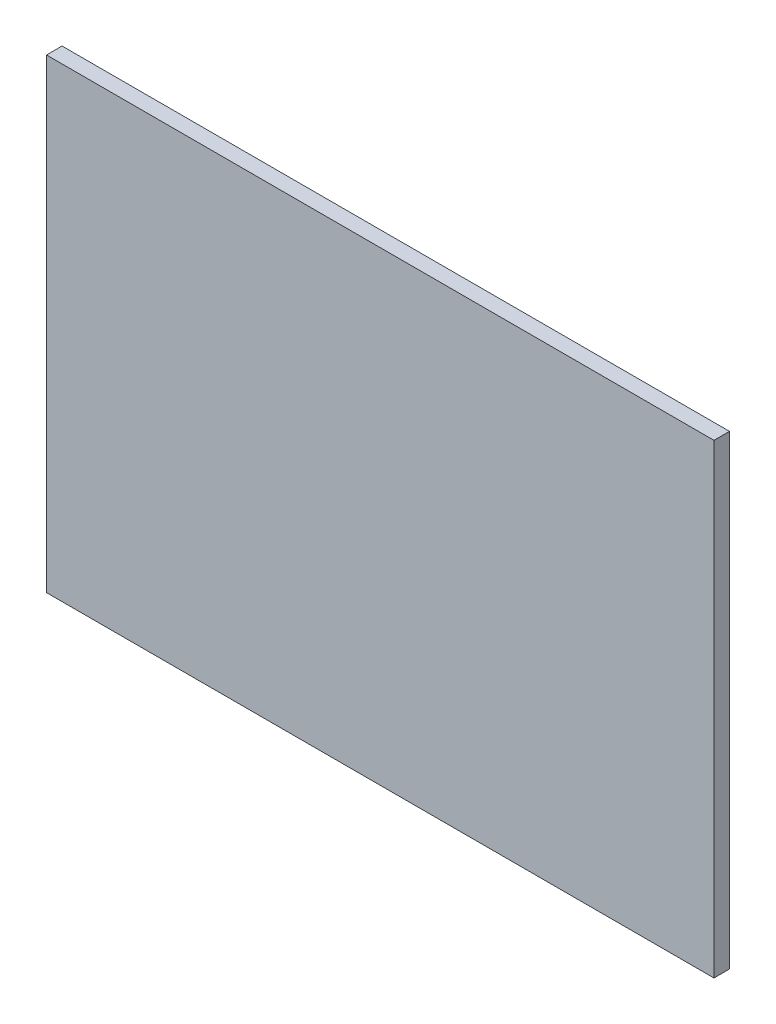
ISO-10303-21;
HEADER;
FILE_DESCRIPTION(('STEP AP214'),'2;1');
FILE_NAME('part.step','',(''),(''),'','','');
FILE_SCHEMA(('AUTOMOTIVE_DESIGN { 1 0 10303 214 1 1 1 1 }'));
ENDSEC;
DATA;
#1=APPLICATION_CONTEXT('core data for automotive mechanical design processes');
#2=APPLICATION_PROTOCOL_DEFINITION('international standard','automotive_design',2000,#1);
#3=PRODUCT_CONTEXT('',#1,'mechanical');
#4=PRODUCT('Part','Part','',(#3));
#5=PRODUCT_RELATED_PRODUCT_CATEGORY('part','',(#4));
#6=PRODUCT_DEFINITION_FORMATION('','',#4);
#7=PRODUCT_DEFINITION_CONTEXT('part definition',#1,'design');
#8=PRODUCT_DEFINITION('design','',#6,#7);
#9=PRODUCT_DEFINITION_SHAPE('','',#8);
#10=(LENGTH_UNIT() NAMED_UNIT(*) SI_UNIT(.MILLI.,.METRE.));
#11=(NAMED_UNIT(*) PLANE_ANGLE_UNIT() SI_UNIT($,.RADIAN.));
#12=(NAMED_UNIT(*) SI_UNIT($,.STERADIAN.) SOLID_ANGLE_UNIT());
#13=UNCERTAINTY_MEASURE_WITH_UNIT(LENGTH_MEASURE(1.E-05),#10,'distance_accuracy_value','');
#14=(GEOMETRIC_REPRESENTATION_CONTEXT(3) GLOBAL_UNCERTAINTY_ASSIGNED_CONTEXT((#13)) GLOBAL_UNIT_ASSIGNED_CONTEXT((#10,
#11,#12)) REPRESENTATION_CONTEXT('',''));
#15=CARTESIAN_POINT('',(0.,0.,0.));
#16=DIRECTION('',(0.,0.,1.));
#17=DIRECTION('',(1.,0.,0.));
#18=AXIS2_PLACEMENT_3D('',#15,#16,#17);
#19=CARTESIAN_POINT('',(-162.560975609756,0.,10.));
#20=DIRECTION('',(1.,0.,0.));
#21=DIRECTION('',(0.,0.,-1.));
#22=AXIS2_PLACEMENT_3D('',#19,#20,#21);
#23=PLANE('',#22);
#24=DIRECTION('',(0.,-1.,0.));
#25=VECTOR('',#24,1.);
#26=CARTESIAN_POINT('',(-162.560975609756,0.,0.));
#27=LINE('',#26,#25);
#28=CARTESIAN_POINT('',(-162.560975609756,300.,0.));
#29=VERTEX_POINT('',#28);
#30=CARTESIAN_POINT('',(-162.560975609756,0.,0.));
#31=VERTEX_POINT('',#30);
#32=EDGE_CURVE('E107',#29,#31,#27,.T.);
#33=ORIENTED_EDGE('',*,*,#32,.T.);
#34=DIRECTION('',(0.,0.,-1.));
#35=VECTOR('',#34,1.);
#36=CARTESIAN_POINT('',(-162.560975609756,0.,10.));
#37=LINE('',#36,#35);
#38=CARTESIAN_POINT('',(-162.560975609756,0.,10.));
#39=VERTEX_POINT('',#38);
#40=EDGE_CURVE('E11',#39,#31,#37,.T.);
#41=ORIENTED_EDGE('',*,*,#40,.F.);
#42=DIRECTION('',(0.,-1.,0.));
#43=VECTOR('',#42,1.);
#44=CARTESIAN_POINT('',(-162.560975609756,0.,10.));
#45=LINE('',#44,#43);
#46=CARTESIAN_POINT('',(-162.560975609756,300.,10.));
#47=VERTEX_POINT('',#46);
#48=EDGE_CURVE('E91',#47,#39,#45,.T.);
#49=ORIENTED_EDGE('',*,*,#48,.F.);
#50=DIRECTION('',(0.,0.,-1.));
#51=VECTOR('',#50,1.);
#52=CARTESIAN_POINT('',(-162.560975609756,300.,10.));
#53=LINE('',#52,#51);
#54=EDGE_CURVE('E103',#47,#29,#53,.T.);
#55=ORIENTED_EDGE('',*,*,#54,.T.);
#56=EDGE_LOOP('',(#33,#41,#49,#55));
#57=FACE_BOUND('',#56,.T.);
#58=ADVANCED_FACE('F39',(#57),#23,.F.);
#59=CARTESIAN_POINT('',(267.439024390244,0.,10.));
#60=DIRECTION('',(0.,1.,0.));
#61=DIRECTION('',(0.,0.,1.));
#62=AXIS2_PLACEMENT_3D('',#59,#60,#61);
#63=PLANE('',#62);
#64=DIRECTION('',(1.,0.,0.));
#65=VECTOR('',#64,1.);
#66=CARTESIAN_POINT('',(267.439024390244,0.,0.));
#67=LINE('',#66,#65);
#68=CARTESIAN_POINT('',(267.439024390244,0.,0.));
#69=VERTEX_POINT('',#68);
#70=EDGE_CURVE('E96',#31,#69,#67,.T.);
#71=ORIENTED_EDGE('',*,*,#70,.T.);
#72=DIRECTION('',(0.,0.,-1.));
#73=VECTOR('',#72,1.);
#74=CARTESIAN_POINT('',(267.439024390244,0.,10.));
#75=LINE('',#74,#73);
#76=CARTESIAN_POINT('',(267.439024390244,0.,10.));
#77=VERTEX_POINT('',#76);
#78=EDGE_CURVE('E48',#77,#69,#75,.T.);
#79=ORIENTED_EDGE('',*,*,#78,.F.);
#80=DIRECTION('',(1.,0.,0.));
#81=VECTOR('',#80,1.);
#82=CARTESIAN_POINT('',(267.439024390244,0.,10.));
#83=LINE('',#82,#81);
#84=EDGE_CURVE('E86',#39,#77,#83,.T.);
#85=ORIENTED_EDGE('',*,*,#84,.F.);
#86=ORIENTED_EDGE('',*,*,#40,.T.);
#87=EDGE_LOOP('',(#71,#79,#85,#86));
#88=FACE_BOUND('',#87,.T.);
#89=ADVANCED_FACE('F95',(#88),#63,.F.);
#90=CARTESIAN_POINT('',(267.439024390244,300.,10.));
#91=DIRECTION('',(-1.,0.,0.));
#92=DIRECTION('',(0.,-1.,0.));
#93=AXIS2_PLACEMENT_3D('',#90,#91,#92);
#94=PLANE('',#93);
#95=DIRECTION('',(0.,1.,0.));
#96=VECTOR('',#95,1.);
#97=CARTESIAN_POINT('',(267.439024390244,300.,0.));
#98=LINE('',#97,#96);
#99=CARTESIAN_POINT('',(267.439024390244,300.,0.));
#100=VERTEX_POINT('',#99);
#101=EDGE_CURVE('E73',#69,#100,#98,.T.);
#102=ORIENTED_EDGE('',*,*,#101,.T.);
#103=DIRECTION('',(0.,0.,-1.));
#104=VECTOR('',#103,1.);
#105=CARTESIAN_POINT('',(267.439024390244,300.,10.));
#106=LINE('',#105,#104);
#107=CARTESIAN_POINT('',(267.439024390244,300.,10.));
#108=VERTEX_POINT('',#107);
#109=EDGE_CURVE('E98',#108,#100,#106,.T.);
#110=ORIENTED_EDGE('',*,*,#109,.F.);
#111=DIRECTION('',(0.,1.,0.));
#112=VECTOR('',#111,1.);
#113=CARTESIAN_POINT('',(267.439024390244,300.,10.));
#114=LINE('',#113,#112);
#115=EDGE_CURVE('E89',#77,#108,#114,.T.);
#116=ORIENTED_EDGE('',*,*,#115,.F.);
#117=ORIENTED_EDGE('',*,*,#78,.T.);
#118=EDGE_LOOP('',(#102,#110,#116,#117));
#119=FACE_BOUND('',#118,.T.);
#120=ADVANCED_FACE('F99',(#119),#94,.F.);
#121=CARTESIAN_POINT('',(-162.560975609756,300.,10.));
#122=DIRECTION('',(0.,-1.,0.));
#123=DIRECTION('',(0.,0.,-1.));
#124=AXIS2_PLACEMENT_3D('',#121,#122,#123);
#125=PLANE('',#124);
#126=DIRECTION('',(-1.,0.,0.));
#127=VECTOR('',#126,1.);
#128=CARTESIAN_POINT('',(-162.560975609756,300.,0.));
#129=LINE('',#128,#127);
#130=EDGE_CURVE('E79',#100,#29,#129,.T.);
#131=ORIENTED_EDGE('',*,*,#130,.T.);
#132=ORIENTED_EDGE('',*,*,#54,.F.);
#133=DIRECTION('',(-1.,0.,0.));
#134=VECTOR('',#133,1.);
#135=CARTESIAN_POINT('',(-162.560975609756,300.,10.));
#136=LINE('',#135,#134);
#137=EDGE_CURVE('E56',#108,#47,#136,.T.);
#138=ORIENTED_EDGE('',*,*,#137,.F.);
#139=ORIENTED_EDGE('',*,*,#109,.T.);
#140=EDGE_LOOP('',(#131,#132,#138,#139));
#141=FACE_BOUND('',#140,.T.);
#142=ADVANCED_FACE('F120',(#141),#125,.F.);
#143=CARTESIAN_POINT('',(0.,0.,10.));
#144=DIRECTION('',(0.,0.,-1.));
#145=DIRECTION('',(-1.,0.,0.));
#146=AXIS2_PLACEMENT_3D('',#143,#144,#145);
#147=PLANE('',#146);
#148=ORIENTED_EDGE('',*,*,#48,.T.);
#149=ORIENTED_EDGE('',*,*,#84,.T.);
#150=ORIENTED_EDGE('',*,*,#115,.T.);
#151=ORIENTED_EDGE('',*,*,#137,.T.);
#152=EDGE_LOOP('',(#148,#149,#150,#151));
#153=FACE_BOUND('',#152,.T.);
#154=ADVANCED_FACE('F87',(#153),#147,.F.);
#155=CARTESIAN_POINT('',(0.,0.,0.));
#156=DIRECTION('',(0.,0.,-1.));
#157=DIRECTION('',(-1.,0.,0.));
#158=AXIS2_PLACEMENT_3D('',#155,#156,#157);
#159=PLANE('',#158);
#160=ORIENTED_EDGE('',*,*,#32,.F.);
#161=ORIENTED_EDGE('',*,*,#130,.F.);
#162=ORIENTED_EDGE('',*,*,#101,.F.);
#163=ORIENTED_EDGE('',*,*,#70,.F.);
#164=EDGE_LOOP('',(#160,#161,#162,#163));
#165=FACE_BOUND('',#164,.T.);
#166=ADVANCED_FACE('F123',(#165),#159,.T.);
#167=CLOSED_SHELL('',(#58,#89,#120,#142,#154,#166));
#168=MANIFOLD_SOLID_BREP('B2',#167);
#169=ADVANCED_BREP_SHAPE_REPRESENTATION('',(#18,#168),#14);
#170=SHAPE_DEFINITION_REPRESENTATION(#9,#169);
ENDSEC;
END-ISO-10303-21;
